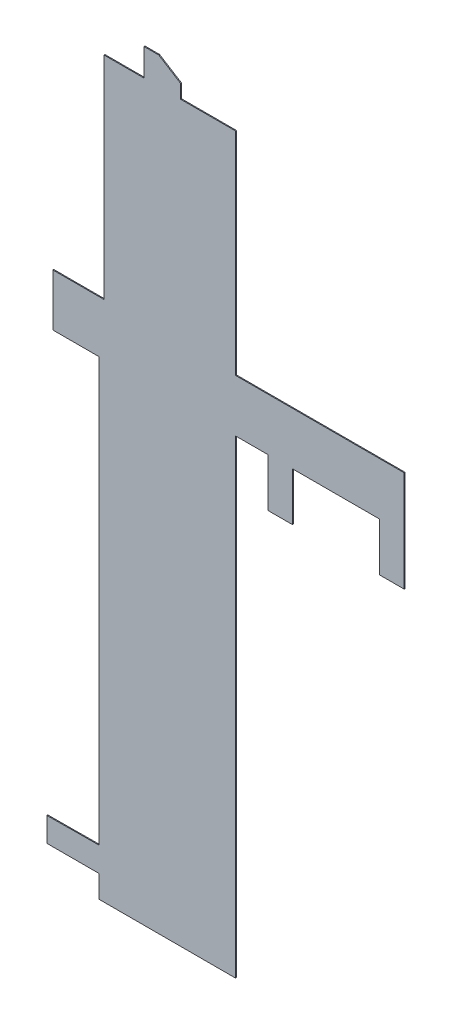
ISO-10303-21;
HEADER;
FILE_DESCRIPTION(('STEP AP214'),'2;1');
FILE_NAME('part.step','',(''),(''),'','','');
FILE_SCHEMA(('AUTOMOTIVE_DESIGN { 1 0 10303 214 1 1 1 1 }'));
ENDSEC;
DATA;
#1=APPLICATION_CONTEXT('core data for automotive mechanical design processes');
#2=APPLICATION_PROTOCOL_DEFINITION('international standard','automotive_design',2000,#1);
#3=PRODUCT_CONTEXT('',#1,'mechanical');
#4=PRODUCT('Part','Part','',(#3));
#5=PRODUCT_RELATED_PRODUCT_CATEGORY('part','',(#4));
#6=PRODUCT_DEFINITION_FORMATION('','',#4);
#7=PRODUCT_DEFINITION_CONTEXT('part definition',#1,'design');
#8=PRODUCT_DEFINITION('design','',#6,#7);
#9=PRODUCT_DEFINITION_SHAPE('','',#8);
#10=(LENGTH_UNIT() NAMED_UNIT(*) SI_UNIT(.MILLI.,.METRE.));
#11=(NAMED_UNIT(*) PLANE_ANGLE_UNIT() SI_UNIT($,.RADIAN.));
#12=(NAMED_UNIT(*) SI_UNIT($,.STERADIAN.) SOLID_ANGLE_UNIT());
#13=UNCERTAINTY_MEASURE_WITH_UNIT(LENGTH_MEASURE(1.E-05),#10,'distance_accuracy_value','');
#14=(GEOMETRIC_REPRESENTATION_CONTEXT(3) GLOBAL_UNCERTAINTY_ASSIGNED_CONTEXT((#13)) GLOBAL_UNIT_ASSIGNED_CONTEXT((#10,
#11,#12)) REPRESENTATION_CONTEXT('',''));
#15=CARTESIAN_POINT('',(0.,0.,0.));
#16=DIRECTION('',(0.,0.,1.));
#17=DIRECTION('',(1.,0.,0.));
#18=AXIS2_PLACEMENT_3D('',#15,#16,#17);
#19=CARTESIAN_POINT('',(0.,-1188.1,41.));
#20=DIRECTION('',(0.,-1.,0.));
#21=DIRECTION('',(0.,0.,-1.));
#22=AXIS2_PLACEMENT_3D('',#19,#20,#21);
#23=PLANE('',#22);
#24=DIRECTION('',(1.,0.,0.));
#25=VECTOR('',#24,1.);
#26=CARTESIAN_POINT('',(0.,-1188.1,42.));
#27=LINE('',#26,#25);
#28=CARTESIAN_POINT('',(393.000000000001,-1188.1,42.));
#29=VERTEX_POINT('',#28);
#30=CARTESIAN_POINT('',(542.500000000001,-1188.1,42.));
#31=VERTEX_POINT('',#30);
#32=EDGE_CURVE('E246',#29,#31,#27,.T.);
#33=ORIENTED_EDGE('',*,*,#32,.F.);
#34=DIRECTION('',(0.,0.,1.));
#35=VECTOR('',#34,1.);
#36=CARTESIAN_POINT('',(393.000000000001,-1188.1,41.));
#37=LINE('',#36,#35);
#38=CARTESIAN_POINT('',(393.000000000001,-1188.1,41.));
#39=VERTEX_POINT('',#38);
#40=EDGE_CURVE('E11',#39,#29,#37,.T.);
#41=ORIENTED_EDGE('',*,*,#40,.F.);
#42=DIRECTION('',(1.,0.,0.));
#43=VECTOR('',#42,1.);
#44=CARTESIAN_POINT('',(0.,-1188.1,41.));
#45=LINE('',#44,#43);
#46=CARTESIAN_POINT('',(542.500000000001,-1188.1,41.));
#47=VERTEX_POINT('',#46);
#48=EDGE_CURVE('E319',#39,#47,#45,.T.);
#49=ORIENTED_EDGE('',*,*,#48,.T.);
#50=DIRECTION('',(0.,0.,1.));
#51=VECTOR('',#50,1.);
#52=CARTESIAN_POINT('',(542.500000000001,-1188.1,41.));
#53=LINE('',#52,#51);
#54=EDGE_CURVE('E38',#47,#31,#53,.T.);
#55=ORIENTED_EDGE('',*,*,#54,.T.);
#56=EDGE_LOOP('',(#33,#41,#49,#55));
#57=FACE_BOUND('',#56,.T.);
#58=ADVANCED_FACE('F35',(#57),#23,.T.);
#59=CARTESIAN_POINT('',(393.000000000001,0.,41.));
#60=DIRECTION('',(-1.,0.,0.));
#61=DIRECTION('',(0.,0.,1.));
#62=AXIS2_PLACEMENT_3D('',#59,#60,#61);
#63=PLANE('',#62);
#64=DIRECTION('',(0.,-1.,0.));
#65=VECTOR('',#64,1.);
#66=CARTESIAN_POINT('',(393.000000000001,0.,42.));
#67=LINE('',#66,#65);
#68=CARTESIAN_POINT('',(393.000000000001,-1163.6,42.));
#69=VERTEX_POINT('',#68);
#70=EDGE_CURVE('E317',#69,#29,#67,.T.);
#71=ORIENTED_EDGE('',*,*,#70,.F.);
#72=DIRECTION('',(0.,0.,1.));
#73=VECTOR('',#72,1.);
#74=CARTESIAN_POINT('',(393.000000000001,-1163.6,41.));
#75=LINE('',#74,#73);
#76=CARTESIAN_POINT('',(393.000000000001,-1163.6,41.));
#77=VERTEX_POINT('',#76);
#78=EDGE_CURVE('E44',#77,#69,#75,.T.);
#79=ORIENTED_EDGE('',*,*,#78,.F.);
#80=DIRECTION('',(0.,-1.,0.));
#81=VECTOR('',#80,1.);
#82=CARTESIAN_POINT('',(393.000000000001,0.,41.));
#83=LINE('',#82,#81);
#84=EDGE_CURVE('E236',#77,#39,#83,.T.);
#85=ORIENTED_EDGE('',*,*,#84,.T.);
#86=ORIENTED_EDGE('',*,*,#40,.T.);
#87=EDGE_LOOP('',(#71,#79,#85,#86));
#88=FACE_BOUND('',#87,.T.);
#89=ADVANCED_FACE('F372',(#88),#63,.T.);
#90=CARTESIAN_POINT('',(0.,-1163.6,41.));
#91=DIRECTION('',(0.,-1.,0.));
#92=DIRECTION('',(0.,0.,-1.));
#93=AXIS2_PLACEMENT_3D('',#90,#91,#92);
#94=PLANE('',#93);
#95=DIRECTION('',(1.,0.,0.));
#96=VECTOR('',#95,1.);
#97=CARTESIAN_POINT('',(0.,-1163.6,42.));
#98=LINE('',#97,#96);
#99=CARTESIAN_POINT('',(336.,-1163.6,42.));
#100=VERTEX_POINT('',#99);
#101=EDGE_CURVE('E222',#100,#69,#98,.T.);
#102=ORIENTED_EDGE('',*,*,#101,.F.);
#103=DIRECTION('',(0.,0.,1.));
#104=VECTOR('',#103,1.);
#105=CARTESIAN_POINT('',(336.,-1163.6,41.));
#106=LINE('',#105,#104);
#107=CARTESIAN_POINT('',(336.,-1163.6,41.));
#108=VERTEX_POINT('',#107);
#109=EDGE_CURVE('E217',#108,#100,#106,.T.);
#110=ORIENTED_EDGE('',*,*,#109,.F.);
#111=DIRECTION('',(1.,0.,0.));
#112=VECTOR('',#111,1.);
#113=CARTESIAN_POINT('',(0.,-1163.6,41.));
#114=LINE('',#113,#112);
#115=EDGE_CURVE('E220',#108,#77,#114,.T.);
#116=ORIENTED_EDGE('',*,*,#115,.T.);
#117=ORIENTED_EDGE('',*,*,#78,.T.);
#118=EDGE_LOOP('',(#102,#110,#116,#117));
#119=FACE_BOUND('',#118,.T.);
#120=ADVANCED_FACE('F219',(#119),#94,.T.);
#121=CARTESIAN_POINT('',(336.,0.,41.));
#122=DIRECTION('',(-1.,0.,0.));
#123=DIRECTION('',(0.,0.,1.));
#124=AXIS2_PLACEMENT_3D('',#121,#122,#123);
#125=PLANE('',#124);
#126=DIRECTION('',(0.,-1.,0.));
#127=VECTOR('',#126,1.);
#128=CARTESIAN_POINT('',(336.,0.,42.));
#129=LINE('',#128,#127);
#130=CARTESIAN_POINT('',(336.,-1137.1,42.));
#131=VERTEX_POINT('',#130);
#132=EDGE_CURVE('E314',#131,#100,#129,.T.);
#133=ORIENTED_EDGE('',*,*,#132,.F.);
#134=DIRECTION('',(0.,0.,1.));
#135=VECTOR('',#134,1.);
#136=CARTESIAN_POINT('',(336.,-1137.1,41.));
#137=LINE('',#136,#135);
#138=CARTESIAN_POINT('',(336.,-1137.1,41.));
#139=VERTEX_POINT('',#138);
#140=EDGE_CURVE('E227',#139,#131,#137,.T.);
#141=ORIENTED_EDGE('',*,*,#140,.F.);
#142=DIRECTION('',(0.,-1.,0.));
#143=VECTOR('',#142,1.);
#144=CARTESIAN_POINT('',(336.,0.,41.));
#145=LINE('',#144,#143);
#146=EDGE_CURVE('E234',#139,#108,#145,.T.);
#147=ORIENTED_EDGE('',*,*,#146,.T.);
#148=ORIENTED_EDGE('',*,*,#109,.T.);
#149=EDGE_LOOP('',(#133,#141,#147,#148));
#150=FACE_BOUND('',#149,.T.);
#151=ADVANCED_FACE('F238',(#150),#125,.T.);
#152=CARTESIAN_POINT('',(7.99580199193842,-1139.40178384568,41.));
#153=DIRECTION('',(-0.00701737107335686,0.999975377948487,0.));
#154=DIRECTION('',(-0.999975377948487,-0.00701737107335686,0.));
#155=AXIS2_PLACEMENT_3D('',#152,#153,#154);
#156=PLANE('',#155);
#157=DIRECTION('',(-0.999975377948487,-0.00701737107335686,0.));
#158=VECTOR('',#157,1.);
#159=CARTESIAN_POINT('',(7.99580199193842,-1139.40178384568,42.));
#160=LINE('',#159,#158);
#161=CARTESIAN_POINT('',(393.000000000001,-1136.7,42.));
#162=VERTEX_POINT('',#161);
#163=EDGE_CURVE('E311',#162,#131,#160,.T.);
#164=ORIENTED_EDGE('',*,*,#163,.F.);
#165=DIRECTION('',(0.,0.,1.));
#166=VECTOR('',#165,1.);
#167=CARTESIAN_POINT('',(393.000000000001,-1136.7,41.));
#168=LINE('',#167,#166);
#169=CARTESIAN_POINT('',(393.000000000001,-1136.7,41.));
#170=VERTEX_POINT('',#169);
#171=EDGE_CURVE('E323',#170,#162,#168,.T.);
#172=ORIENTED_EDGE('',*,*,#171,.F.);
#173=DIRECTION('',(-0.999975377948487,-0.00701737107335686,0.));
#174=VECTOR('',#173,1.);
#175=CARTESIAN_POINT('',(7.99580199193842,-1139.40178384568,41.));
#176=LINE('',#175,#174);
#177=EDGE_CURVE('E239',#170,#139,#176,.T.);
#178=ORIENTED_EDGE('',*,*,#177,.T.);
#179=ORIENTED_EDGE('',*,*,#140,.T.);
#180=EDGE_LOOP('',(#164,#172,#178,#179));
#181=FACE_BOUND('',#180,.T.);
#182=ADVANCED_FACE('F385',(#181),#156,.T.);
#183=CARTESIAN_POINT('',(393.000000000001,0.,41.));
#184=DIRECTION('',(-1.,0.,0.));
#185=DIRECTION('',(0.,0.,1.));
#186=AXIS2_PLACEMENT_3D('',#183,#184,#185);
#187=PLANE('',#186);
#188=DIRECTION('',(0.,-1.,0.));
#189=VECTOR('',#188,1.);
#190=CARTESIAN_POINT('',(393.000000000001,0.,42.));
#191=LINE('',#190,#189);
#192=CARTESIAN_POINT('',(393.000000000001,-673.199999999998,42.));
#193=VERTEX_POINT('',#192);
#194=EDGE_CURVE('E308',#193,#162,#191,.T.);
#195=ORIENTED_EDGE('',*,*,#194,.F.);
#196=DIRECTION('',(0.,0.,1.));
#197=VECTOR('',#196,1.);
#198=CARTESIAN_POINT('',(393.000000000001,-673.199999999998,41.));
#199=LINE('',#198,#197);
#200=CARTESIAN_POINT('',(393.000000000001,-673.199999999998,41.));
#201=VERTEX_POINT('',#200);
#202=EDGE_CURVE('E325',#201,#193,#199,.T.);
#203=ORIENTED_EDGE('',*,*,#202,.F.);
#204=DIRECTION('',(0.,-1.,0.));
#205=VECTOR('',#204,1.);
#206=CARTESIAN_POINT('',(393.000000000001,0.,41.));
#207=LINE('',#206,#205);
#208=EDGE_CURVE('E241',#201,#170,#207,.T.);
#209=ORIENTED_EDGE('',*,*,#208,.T.);
#210=ORIENTED_EDGE('',*,*,#171,.T.);
#211=EDGE_LOOP('',(#195,#203,#209,#210));
#212=FACE_BOUND('',#211,.T.);
#213=ADVANCED_FACE('F388',(#212),#187,.T.);
#214=CARTESIAN_POINT('',(0.,-673.199999999998,41.));
#215=DIRECTION('',(0.,1.,0.));
#216=DIRECTION('',(0.,0.,1.));
#217=AXIS2_PLACEMENT_3D('',#214,#215,#216);
#218=PLANE('',#217);
#219=DIRECTION('',(-1.,0.,0.));
#220=VECTOR('',#219,1.);
#221=CARTESIAN_POINT('',(0.,-673.199999999998,42.));
#222=LINE('',#221,#220);
#223=CARTESIAN_POINT('',(342.500000000001,-673.199999999998,42.));
#224=VERTEX_POINT('',#223);
#225=EDGE_CURVE('E306',#193,#224,#222,.T.);
#226=ORIENTED_EDGE('',*,*,#225,.T.);
#227=DIRECTION('',(0.,0.,1.));
#228=VECTOR('',#227,1.);
#229=CARTESIAN_POINT('',(342.500000000001,-673.199999999998,41.));
#230=LINE('',#229,#228);
#231=CARTESIAN_POINT('',(342.500000000001,-673.199999999998,41.));
#232=VERTEX_POINT('',#231);
#233=EDGE_CURVE('E327',#232,#224,#230,.T.);
#234=ORIENTED_EDGE('',*,*,#233,.F.);
#235=DIRECTION('',(-1.,0.,0.));
#236=VECTOR('',#235,1.);
#237=CARTESIAN_POINT('',(0.,-673.199999999998,41.));
#238=LINE('',#237,#236);
#239=EDGE_CURVE('E554',#201,#232,#238,.T.);
#240=ORIENTED_EDGE('',*,*,#239,.F.);
#241=ORIENTED_EDGE('',*,*,#202,.T.);
#242=EDGE_LOOP('',(#226,#234,#240,#241));
#243=FACE_BOUND('',#242,.T.);
#244=ADVANCED_FACE('F392',(#243),#218,.F.);
#245=CARTESIAN_POINT('',(342.499999999994,3.66909232041685E-12,41.));
#246=DIRECTION('',(1.,0.,0.));
#247=DIRECTION('',(0.,1.,0.));
#248=AXIS2_PLACEMENT_3D('',#245,#246,#247);
#249=PLANE('',#248);
#250=DIRECTION('',(0.,1.,0.));
#251=VECTOR('',#250,1.);
#252=CARTESIAN_POINT('',(342.499999999994,3.66909232041685E-12,42.));
#253=LINE('',#252,#251);
#254=CARTESIAN_POINT('',(342.500000000001,-616.199999999998,42.));
#255=VERTEX_POINT('',#254);
#256=EDGE_CURVE('E304',#224,#255,#253,.T.);
#257=ORIENTED_EDGE('',*,*,#256,.T.);
#258=DIRECTION('',(0.,0.,1.));
#259=VECTOR('',#258,1.);
#260=CARTESIAN_POINT('',(342.500000000001,-616.199999999998,41.));
#261=LINE('',#260,#259);
#262=CARTESIAN_POINT('',(342.500000000001,-616.199999999998,41.));
#263=VERTEX_POINT('',#262);
#264=EDGE_CURVE('E330',#263,#255,#261,.T.);
#265=ORIENTED_EDGE('',*,*,#264,.F.);
#266=DIRECTION('',(0.,1.,0.));
#267=VECTOR('',#266,1.);
#268=CARTESIAN_POINT('',(342.499999999994,3.66909232041685E-12,41.));
#269=LINE('',#268,#267);
#270=EDGE_CURVE('E546',#232,#263,#269,.T.);
#271=ORIENTED_EDGE('',*,*,#270,.F.);
#272=ORIENTED_EDGE('',*,*,#233,.T.);
#273=EDGE_LOOP('',(#257,#265,#271,#272));
#274=FACE_BOUND('',#273,.T.);
#275=ADVANCED_FACE('F396',(#274),#249,.F.);
#276=CARTESIAN_POINT('',(-1.36823885554802E-11,-616.199999999989,41.));
#277=DIRECTION('',(0.,-1.,0.));
#278=DIRECTION('',(1.,0.,0.));
#279=AXIS2_PLACEMENT_3D('',#276,#277,#278);
#280=PLANE('',#279);
#281=DIRECTION('',(1.,0.,0.));
#282=VECTOR('',#281,1.);
#283=CARTESIAN_POINT('',(-1.36823885554802E-11,-616.199999999989,42.));
#284=LINE('',#283,#282);
#285=CARTESIAN_POINT('',(398.500000000001,-616.199999999998,42.));
#286=VERTEX_POINT('',#285);
#287=EDGE_CURVE('E301',#255,#286,#284,.T.);
#288=ORIENTED_EDGE('',*,*,#287,.T.);
#289=DIRECTION('',(0.,0.,1.));
#290=VECTOR('',#289,1.);
#291=CARTESIAN_POINT('',(398.500000000001,-616.199999999998,41.));
#292=LINE('',#291,#290);
#293=CARTESIAN_POINT('',(398.500000000001,-616.199999999998,41.));
#294=VERTEX_POINT('',#293);
#295=EDGE_CURVE('E333',#294,#286,#292,.T.);
#296=ORIENTED_EDGE('',*,*,#295,.F.);
#297=DIRECTION('',(1.,0.,0.));
#298=VECTOR('',#297,1.);
#299=CARTESIAN_POINT('',(-1.36823885554802E-11,-616.199999999989,41.));
#300=LINE('',#299,#298);
#301=EDGE_CURVE('E544',#263,#294,#300,.T.);
#302=ORIENTED_EDGE('',*,*,#301,.F.);
#303=ORIENTED_EDGE('',*,*,#264,.T.);
#304=EDGE_LOOP('',(#288,#296,#302,#303));
#305=FACE_BOUND('',#304,.T.);
#306=ADVANCED_FACE('F400',(#305),#280,.F.);
#307=CARTESIAN_POINT('',(398.500000000001,0.,41.));
#308=DIRECTION('',(-1.,0.,0.));
#309=DIRECTION('',(0.,0.,1.));
#310=AXIS2_PLACEMENT_3D('',#307,#308,#309);
#311=PLANE('',#310);
#312=DIRECTION('',(0.,-1.,0.));
#313=VECTOR('',#312,1.);
#314=CARTESIAN_POINT('',(398.500000000001,0.,42.));
#315=LINE('',#314,#313);
#316=CARTESIAN_POINT('',(398.500000000001,-384.199999999999,42.));
#317=VERTEX_POINT('',#316);
#318=EDGE_CURVE('E298',#317,#286,#315,.T.);
#319=ORIENTED_EDGE('',*,*,#318,.F.);
#320=DIRECTION('',(0.,0.,1.));
#321=VECTOR('',#320,1.);
#322=CARTESIAN_POINT('',(398.500000000001,-384.199999999999,41.));
#323=LINE('',#322,#321);
#324=CARTESIAN_POINT('',(398.500000000001,-384.199999999999,41.));
#325=VERTEX_POINT('',#324);
#326=EDGE_CURVE('E335',#325,#317,#323,.T.);
#327=ORIENTED_EDGE('',*,*,#326,.F.);
#328=DIRECTION('',(0.,-1.,0.));
#329=VECTOR('',#328,1.);
#330=CARTESIAN_POINT('',(398.500000000001,0.,41.));
#331=LINE('',#330,#329);
#332=EDGE_CURVE('E541',#325,#294,#331,.T.);
#333=ORIENTED_EDGE('',*,*,#332,.T.);
#334=ORIENTED_EDGE('',*,*,#295,.T.);
#335=EDGE_LOOP('',(#319,#327,#333,#334));
#336=FACE_BOUND('',#335,.T.);
#337=ADVANCED_FACE('F404',(#336),#311,.T.);
#338=CARTESIAN_POINT('',(0.,-384.199999999999,41.));
#339=DIRECTION('',(0.,-1.,0.));
#340=DIRECTION('',(0.,0.,-1.));
#341=AXIS2_PLACEMENT_3D('',#338,#339,#340);
#342=PLANE('',#341);
#343=DIRECTION('',(1.,0.,0.));
#344=VECTOR('',#343,1.);
#345=CARTESIAN_POINT('',(0.,-384.199999999999,42.));
#346=LINE('',#345,#344);
#347=CARTESIAN_POINT('',(442.5,-384.2,42.));
#348=VERTEX_POINT('',#347);
#349=EDGE_CURVE('E295',#317,#348,#346,.T.);
#350=ORIENTED_EDGE('',*,*,#349,.T.);
#351=DIRECTION('',(0.,0.,1.));
#352=VECTOR('',#351,1.);
#353=CARTESIAN_POINT('',(442.5,-384.2,41.));
#354=LINE('',#353,#352);
#355=CARTESIAN_POINT('',(442.5,-384.2,41.));
#356=VERTEX_POINT('',#355);
#357=EDGE_CURVE('E338',#356,#348,#354,.T.);
#358=ORIENTED_EDGE('',*,*,#357,.F.);
#359=DIRECTION('',(1.,0.,0.));
#360=VECTOR('',#359,1.);
#361=CARTESIAN_POINT('',(0.,-384.199999999999,41.));
#362=LINE('',#361,#360);
#363=EDGE_CURVE('E560',#325,#356,#362,.T.);
#364=ORIENTED_EDGE('',*,*,#363,.F.);
#365=ORIENTED_EDGE('',*,*,#326,.T.);
#366=EDGE_LOOP('',(#350,#358,#364,#365));
#367=FACE_BOUND('',#366,.T.);
#368=ADVANCED_FACE('F408',(#367),#342,.F.);
#369=CARTESIAN_POINT('',(442.500000000001,-8.1878948066106E-13,41.));
#370=DIRECTION('',(-1.,0.,0.));
#371=DIRECTION('',(0.,-1.,0.));
#372=AXIS2_PLACEMENT_3D('',#369,#370,#371);
#373=PLANE('',#372);
#374=DIRECTION('',(0.,-1.,0.));
#375=VECTOR('',#374,1.);
#376=CARTESIAN_POINT('',(442.500000000001,-8.1878948066106E-13,42.));
#377=LINE('',#376,#375);
#378=CARTESIAN_POINT('',(442.5,-354.2,42.));
#379=VERTEX_POINT('',#378);
#380=EDGE_CURVE('E292',#379,#348,#377,.T.);
#381=ORIENTED_EDGE('',*,*,#380,.F.);
#382=DIRECTION('',(0.,0.,1.));
#383=VECTOR('',#382,1.);
#384=CARTESIAN_POINT('',(442.5,-354.2,41.));
#385=LINE('',#384,#383);
#386=CARTESIAN_POINT('',(442.5,-354.2,41.));
#387=VERTEX_POINT('',#386);
#388=EDGE_CURVE('E340',#387,#379,#385,.T.);
#389=ORIENTED_EDGE('',*,*,#388,.F.);
#390=DIRECTION('',(0.,-1.,0.));
#391=VECTOR('',#390,1.);
#392=CARTESIAN_POINT('',(442.500000000001,-8.1878948066106E-13,41.));
#393=LINE('',#392,#391);
#394=EDGE_CURVE('E533',#387,#356,#393,.T.);
#395=ORIENTED_EDGE('',*,*,#394,.T.);
#396=ORIENTED_EDGE('',*,*,#357,.T.);
#397=EDGE_LOOP('',(#381,#389,#395,#396));
#398=FACE_BOUND('',#397,.T.);
#399=ADVANCED_FACE('F412',(#398),#373,.T.);
#400=CARTESIAN_POINT('',(1.22887811038196E-12,-354.200000000002,41.));
#401=DIRECTION('',(0.,1.,0.));
#402=DIRECTION('',(-1.,0.,0.));
#403=AXIS2_PLACEMENT_3D('',#400,#401,#402);
#404=PLANE('',#403);
#405=DIRECTION('',(-1.,0.,0.));
#406=VECTOR('',#405,1.);
#407=CARTESIAN_POINT('',(1.22887811038196E-12,-354.200000000002,42.));
#408=LINE('',#407,#406);
#409=CARTESIAN_POINT('',(458.5,-354.2,42.));
#410=VERTEX_POINT('',#409);
#411=EDGE_CURVE('E289',#410,#379,#408,.T.);
#412=ORIENTED_EDGE('',*,*,#411,.F.);
#413=DIRECTION('',(0.,0.,1.));
#414=VECTOR('',#413,1.);
#415=CARTESIAN_POINT('',(458.5,-354.2,41.));
#416=LINE('',#415,#414);
#417=CARTESIAN_POINT('',(458.5,-354.2,41.));
#418=VERTEX_POINT('',#417);
#419=EDGE_CURVE('E342',#418,#410,#416,.T.);
#420=ORIENTED_EDGE('',*,*,#419,.F.);
#421=DIRECTION('',(-1.,0.,0.));
#422=VECTOR('',#421,1.);
#423=CARTESIAN_POINT('',(1.22887811038196E-12,-354.200000000002,41.));
#424=LINE('',#423,#422);
#425=EDGE_CURVE('E529',#418,#387,#424,.T.);
#426=ORIENTED_EDGE('',*,*,#425,.T.);
#427=ORIENTED_EDGE('',*,*,#388,.T.);
#428=EDGE_LOOP('',(#412,#420,#426,#427));
#429=FACE_BOUND('',#428,.T.);
#430=ADVANCED_FACE('F416',(#429),#404,.T.);
#431=CARTESIAN_POINT('',(-30.3988764044927,-48.6382022471876,41.));
#432=DIRECTION('',(0.529998940003185,0.847998304005085,0.));
#433=DIRECTION('',(-0.847998304005085,0.529998940003185,0.));
#434=AXIS2_PLACEMENT_3D('',#431,#432,#433);
#435=PLANE('',#434);
#436=DIRECTION('',(-0.847998304005085,0.529998940003185,0.));
#437=VECTOR('',#436,1.);
#438=CARTESIAN_POINT('',(-30.3988764044927,-48.6382022471876,42.));
#439=LINE('',#438,#437);
#440=CARTESIAN_POINT('',(482.5,-369.2,42.));
#441=VERTEX_POINT('',#440);
#442=EDGE_CURVE('E286',#441,#410,#439,.T.);
#443=ORIENTED_EDGE('',*,*,#442,.F.);
#444=DIRECTION('',(0.,0.,1.));
#445=VECTOR('',#444,1.);
#446=CARTESIAN_POINT('',(482.5,-369.2,41.));
#447=LINE('',#446,#445);
#448=CARTESIAN_POINT('',(482.5,-369.2,41.));
#449=VERTEX_POINT('',#448);
#450=EDGE_CURVE('E344',#449,#441,#447,.T.);
#451=ORIENTED_EDGE('',*,*,#450,.F.);
#452=DIRECTION('',(-0.847998304005085,0.529998940003185,0.));
#453=VECTOR('',#452,1.);
#454=CARTESIAN_POINT('',(-30.3988764044927,-48.6382022471876,41.));
#455=LINE('',#454,#453);
#456=EDGE_CURVE('E524',#449,#418,#455,.T.);
#457=ORIENTED_EDGE('',*,*,#456,.T.);
#458=ORIENTED_EDGE('',*,*,#419,.T.);
#459=EDGE_LOOP('',(#443,#451,#457,#458));
#460=FACE_BOUND('',#459,.T.);
#461=ADVANCED_FACE('F420',(#460),#435,.T.);
#462=CARTESIAN_POINT('',(482.499999999998,2.06827262309514E-12,41.));
#463=DIRECTION('',(-1.,0.,0.));
#464=DIRECTION('',(0.,-1.,0.));
#465=AXIS2_PLACEMENT_3D('',#462,#463,#464);
#466=PLANE('',#465);
#467=DIRECTION('',(0.,-1.,0.));
#468=VECTOR('',#467,1.);
#469=CARTESIAN_POINT('',(482.499999999998,2.06827262309514E-12,42.));
#470=LINE('',#469,#468);
#471=CARTESIAN_POINT('',(482.5,-384.2,42.));
#472=VERTEX_POINT('',#471);
#473=EDGE_CURVE('E283',#441,#472,#470,.T.);
#474=ORIENTED_EDGE('',*,*,#473,.T.);
#475=DIRECTION('',(0.,0.,1.));
#476=VECTOR('',#475,1.);
#477=CARTESIAN_POINT('',(482.5,-384.2,41.));
#478=LINE('',#477,#476);
#479=CARTESIAN_POINT('',(482.5,-384.2,41.));
#480=VERTEX_POINT('',#479);
#481=EDGE_CURVE('E346',#480,#472,#478,.T.);
#482=ORIENTED_EDGE('',*,*,#481,.F.);
#483=DIRECTION('',(0.,-1.,0.));
#484=VECTOR('',#483,1.);
#485=CARTESIAN_POINT('',(482.499999999998,2.06827262309514E-12,41.));
#486=LINE('',#485,#484);
#487=EDGE_CURVE('E521',#449,#480,#486,.T.);
#488=ORIENTED_EDGE('',*,*,#487,.F.);
#489=ORIENTED_EDGE('',*,*,#450,.T.);
#490=EDGE_LOOP('',(#474,#482,#488,#489));
#491=FACE_BOUND('',#490,.T.);
#492=ADVANCED_FACE('F424',(#491),#466,.F.);
#493=CARTESIAN_POINT('',(-3.55456405050817E-12,-384.199999999996,41.));
#494=DIRECTION('',(0.,1.,0.));
#495=DIRECTION('',(-1.,0.,0.));
#496=AXIS2_PLACEMENT_3D('',#493,#494,#495);
#497=PLANE('',#496);
#498=DIRECTION('',(-1.,0.,0.));
#499=VECTOR('',#498,1.);
#500=CARTESIAN_POINT('',(-3.55456405050817E-12,-384.199999999996,42.));
#501=LINE('',#500,#499);
#502=CARTESIAN_POINT('',(542.5,-384.200000000001,42.));
#503=VERTEX_POINT('',#502);
#504=EDGE_CURVE('E280',#503,#472,#501,.T.);
#505=ORIENTED_EDGE('',*,*,#504,.F.);
#506=DIRECTION('',(0.,0.,1.));
#507=VECTOR('',#506,1.);
#508=CARTESIAN_POINT('',(542.5,-384.200000000001,41.));
#509=LINE('',#508,#507);
#510=CARTESIAN_POINT('',(542.5,-384.200000000001,41.));
#511=VERTEX_POINT('',#510);
#512=EDGE_CURVE('E348',#511,#503,#509,.T.);
#513=ORIENTED_EDGE('',*,*,#512,.F.);
#514=DIRECTION('',(-1.,0.,0.));
#515=VECTOR('',#514,1.);
#516=CARTESIAN_POINT('',(-3.55456405050817E-12,-384.199999999996,41.));
#517=LINE('',#516,#515);
#518=EDGE_CURVE('E519',#511,#480,#517,.T.);
#519=ORIENTED_EDGE('',*,*,#518,.T.);
#520=ORIENTED_EDGE('',*,*,#481,.T.);
#521=EDGE_LOOP('',(#505,#513,#519,#520));
#522=FACE_BOUND('',#521,.T.);
#523=ADVANCED_FACE('F428',(#522),#497,.T.);
#524=CARTESIAN_POINT('',(542.500000000004,-6.14587745774645E-12,41.));
#525=DIRECTION('',(1.,0.,0.));
#526=DIRECTION('',(0.,1.,0.));
#527=AXIS2_PLACEMENT_3D('',#524,#525,#526);
#528=PLANE('',#527);
#529=DIRECTION('',(0.,1.,0.));
#530=VECTOR('',#529,1.);
#531=CARTESIAN_POINT('',(542.500000000004,-6.14587745774645E-12,42.));
#532=LINE('',#531,#530);
#533=CARTESIAN_POINT('',(542.5,-616.2,42.));
#534=VERTEX_POINT('',#533);
#535=EDGE_CURVE('E277',#534,#503,#532,.T.);
#536=ORIENTED_EDGE('',*,*,#535,.F.);
#537=DIRECTION('',(0.,0.,1.));
#538=VECTOR('',#537,1.);
#539=CARTESIAN_POINT('',(542.5,-616.2,41.));
#540=LINE('',#539,#538);
#541=CARTESIAN_POINT('',(542.5,-616.2,41.));
#542=VERTEX_POINT('',#541);
#543=EDGE_CURVE('E350',#542,#534,#540,.T.);
#544=ORIENTED_EDGE('',*,*,#543,.F.);
#545=DIRECTION('',(0.,1.,0.));
#546=VECTOR('',#545,1.);
#547=CARTESIAN_POINT('',(542.500000000004,-6.14587745774645E-12,41.));
#548=LINE('',#547,#546);
#549=EDGE_CURVE('E567',#542,#511,#548,.T.);
#550=ORIENTED_EDGE('',*,*,#549,.T.);
#551=ORIENTED_EDGE('',*,*,#512,.T.);
#552=EDGE_LOOP('',(#536,#544,#550,#551));
#553=FACE_BOUND('',#552,.T.);
#554=ADVANCED_FACE('F432',(#553),#528,.T.);
#555=CARTESIAN_POINT('',(0.,-616.2,41.));
#556=DIRECTION('',(0.,1.,0.));
#557=DIRECTION('',(0.,0.,1.));
#558=AXIS2_PLACEMENT_3D('',#555,#556,#557);
#559=PLANE('',#558);
#560=DIRECTION('',(-1.,0.,0.));
#561=VECTOR('',#560,1.);
#562=CARTESIAN_POINT('',(0.,-616.2,42.));
#563=LINE('',#562,#561);
#564=CARTESIAN_POINT('',(727.5,-616.2,42.));
#565=VERTEX_POINT('',#564);
#566=EDGE_CURVE('E274',#565,#534,#563,.T.);
#567=ORIENTED_EDGE('',*,*,#566,.F.);
#568=DIRECTION('',(0.,0.,1.));
#569=VECTOR('',#568,1.);
#570=CARTESIAN_POINT('',(727.5,-616.2,41.));
#571=LINE('',#570,#569);
#572=CARTESIAN_POINT('',(727.5,-616.2,41.));
#573=VERTEX_POINT('',#572);
#574=EDGE_CURVE('E352',#573,#565,#571,.T.);
#575=ORIENTED_EDGE('',*,*,#574,.F.);
#576=DIRECTION('',(-1.,0.,0.));
#577=VECTOR('',#576,1.);
#578=CARTESIAN_POINT('',(0.,-616.2,41.));
#579=LINE('',#578,#577);
#580=EDGE_CURVE('E510',#573,#542,#579,.T.);
#581=ORIENTED_EDGE('',*,*,#580,.T.);
#582=ORIENTED_EDGE('',*,*,#543,.T.);
#583=EDGE_LOOP('',(#567,#575,#581,#582));
#584=FACE_BOUND('',#583,.T.);
#585=ADVANCED_FACE('F436',(#584),#559,.T.);
#586=CARTESIAN_POINT('',(727.5,0.,41.));
#587=DIRECTION('',(1.,0.,0.));
#588=DIRECTION('',(0.,0.,-1.));
#589=AXIS2_PLACEMENT_3D('',#586,#587,#588);
#590=PLANE('',#589);
#591=DIRECTION('',(0.,1.,0.));
#592=VECTOR('',#591,1.);
#593=CARTESIAN_POINT('',(727.5,0.,42.));
#594=LINE('',#593,#592);
#595=CARTESIAN_POINT('',(727.5,-726.599999999999,42.));
#596=VERTEX_POINT('',#595);
#597=EDGE_CURVE('E271',#596,#565,#594,.T.);
#598=ORIENTED_EDGE('',*,*,#597,.F.);
#599=DIRECTION('',(0.,0.,1.));
#600=VECTOR('',#599,1.);
#601=CARTESIAN_POINT('',(727.5,-726.599999999999,41.));
#602=LINE('',#601,#600);
#603=CARTESIAN_POINT('',(727.5,-726.599999999999,41.));
#604=VERTEX_POINT('',#603);
#605=EDGE_CURVE('E354',#604,#596,#602,.T.);
#606=ORIENTED_EDGE('',*,*,#605,.F.);
#607=DIRECTION('',(0.,1.,0.));
#608=VECTOR('',#607,1.);
#609=CARTESIAN_POINT('',(727.5,0.,41.));
#610=LINE('',#609,#608);
#611=EDGE_CURVE('E506',#604,#573,#610,.T.);
#612=ORIENTED_EDGE('',*,*,#611,.T.);
#613=ORIENTED_EDGE('',*,*,#574,.T.);
#614=EDGE_LOOP('',(#598,#606,#612,#613));
#615=FACE_BOUND('',#614,.T.);
#616=ADVANCED_FACE('F440',(#615),#590,.T.);
#617=CARTESIAN_POINT('',(0.,-726.599999999999,41.));
#618=DIRECTION('',(0.,-1.,0.));
#619=DIRECTION('',(0.,0.,-1.));
#620=AXIS2_PLACEMENT_3D('',#617,#618,#619);
#621=PLANE('',#620);
#622=DIRECTION('',(1.,0.,0.));
#623=VECTOR('',#622,1.);
#624=CARTESIAN_POINT('',(0.,-726.599999999999,42.));
#625=LINE('',#624,#623);
#626=CARTESIAN_POINT('',(700.5,-726.599999999999,42.));
#627=VERTEX_POINT('',#626);
#628=EDGE_CURVE('E268',#627,#596,#625,.T.);
#629=ORIENTED_EDGE('',*,*,#628,.F.);
#630=DIRECTION('',(0.,0.,1.));
#631=VECTOR('',#630,1.);
#632=CARTESIAN_POINT('',(700.5,-726.599999999999,41.));
#633=LINE('',#632,#631);
#634=CARTESIAN_POINT('',(700.5,-726.599999999999,41.));
#635=VERTEX_POINT('',#634);
#636=EDGE_CURVE('E356',#635,#627,#633,.T.);
#637=ORIENTED_EDGE('',*,*,#636,.F.);
#638=DIRECTION('',(1.,0.,0.));
#639=VECTOR('',#638,1.);
#640=CARTESIAN_POINT('',(0.,-726.599999999999,41.));
#641=LINE('',#640,#639);
#642=EDGE_CURVE('E571',#635,#604,#641,.T.);
#643=ORIENTED_EDGE('',*,*,#642,.T.);
#644=ORIENTED_EDGE('',*,*,#605,.T.);
#645=EDGE_LOOP('',(#629,#637,#643,#644));
#646=FACE_BOUND('',#645,.T.);
#647=ADVANCED_FACE('F444',(#646),#621,.T.);
#648=CARTESIAN_POINT('',(700.499999999998,1.46737967688664E-12,41.));
#649=DIRECTION('',(-1.,0.,0.));
#650=DIRECTION('',(0.,-1.,0.));
#651=AXIS2_PLACEMENT_3D('',#648,#649,#650);
#652=PLANE('',#651);
#653=DIRECTION('',(0.,-1.,0.));
#654=VECTOR('',#653,1.);
#655=CARTESIAN_POINT('',(700.499999999998,1.46737967688664E-12,42.));
#656=LINE('',#655,#654);
#657=CARTESIAN_POINT('',(700.5,-673.599999999999,42.));
#658=VERTEX_POINT('',#657);
#659=EDGE_CURVE('E265',#658,#627,#656,.T.);
#660=ORIENTED_EDGE('',*,*,#659,.F.);
#661=DIRECTION('',(0.,0.,1.));
#662=VECTOR('',#661,1.);
#663=CARTESIAN_POINT('',(700.5,-673.599999999999,41.));
#664=LINE('',#663,#662);
#665=CARTESIAN_POINT('',(700.5,-673.599999999999,41.));
#666=VERTEX_POINT('',#665);
#667=EDGE_CURVE('E358',#666,#658,#664,.T.);
#668=ORIENTED_EDGE('',*,*,#667,.F.);
#669=DIRECTION('',(0.,-1.,0.));
#670=VECTOR('',#669,1.);
#671=CARTESIAN_POINT('',(700.499999999998,1.46737967688664E-12,41.));
#672=LINE('',#671,#670);
#673=EDGE_CURVE('E499',#666,#635,#672,.T.);
#674=ORIENTED_EDGE('',*,*,#673,.T.);
#675=ORIENTED_EDGE('',*,*,#636,.T.);
#676=EDGE_LOOP('',(#660,#668,#674,#675));
#677=FACE_BOUND('',#676,.T.);
#678=ADVANCED_FACE('F448',(#677),#652,.T.);
#679=CARTESIAN_POINT('',(2.10660909686632E-12,-673.600000000001,41.));
#680=DIRECTION('',(0.,-1.,0.));
#681=DIRECTION('',(1.,0.,0.));
#682=AXIS2_PLACEMENT_3D('',#679,#680,#681);
#683=PLANE('',#682);
#684=DIRECTION('',(1.,0.,0.));
#685=VECTOR('',#684,1.);
#686=CARTESIAN_POINT('',(2.10660909686632E-12,-673.600000000001,42.));
#687=LINE('',#686,#685);
#688=CARTESIAN_POINT('',(604.999999999999,-673.599999999999,42.));
#689=VERTEX_POINT('',#688);
#690=EDGE_CURVE('E256',#689,#658,#687,.T.);
#691=ORIENTED_EDGE('',*,*,#690,.F.);
#692=DIRECTION('',(0.,0.,1.));
#693=VECTOR('',#692,1.);
#694=CARTESIAN_POINT('',(604.999999999999,-673.599999999999,41.));
#695=LINE('',#694,#693);
#696=CARTESIAN_POINT('',(604.999999999999,-673.599999999999,41.));
#697=VERTEX_POINT('',#696);
#698=EDGE_CURVE('E360',#697,#689,#695,.T.);
#699=ORIENTED_EDGE('',*,*,#698,.F.);
#700=DIRECTION('',(1.,0.,0.));
#701=VECTOR('',#700,1.);
#702=CARTESIAN_POINT('',(2.10660909686632E-12,-673.600000000001,41.));
#703=LINE('',#702,#701);
#704=EDGE_CURVE('E495',#697,#666,#703,.T.);
#705=ORIENTED_EDGE('',*,*,#704,.T.);
#706=ORIENTED_EDGE('',*,*,#667,.T.);
#707=EDGE_LOOP('',(#691,#699,#705,#706));
#708=FACE_BOUND('',#707,.T.);
#709=ADVANCED_FACE('F452',(#708),#683,.T.);
#710=CARTESIAN_POINT('',(604.999999999998,1.26733005641173E-12,41.));
#711=DIRECTION('',(1.,0.,0.));
#712=DIRECTION('',(0.,1.,0.));
#713=AXIS2_PLACEMENT_3D('',#710,#711,#712);
#714=PLANE('',#713);
#715=DIRECTION('',(0.,1.,0.));
#716=VECTOR('',#715,1.);
#717=CARTESIAN_POINT('',(604.999999999998,1.26733005641173E-12,42.));
#718=LINE('',#717,#716);
#719=CARTESIAN_POINT('',(605.,-726.599999999999,42.));
#720=VERTEX_POINT('',#719);
#721=EDGE_CURVE('E262',#720,#689,#718,.T.);
#722=ORIENTED_EDGE('',*,*,#721,.F.);
#723=DIRECTION('',(0.,0.,1.));
#724=VECTOR('',#723,1.);
#725=CARTESIAN_POINT('',(605.,-726.599999999999,41.));
#726=LINE('',#725,#724);
#727=CARTESIAN_POINT('',(605.,-726.599999999999,41.));
#728=VERTEX_POINT('',#727);
#729=EDGE_CURVE('E362',#728,#720,#726,.T.);
#730=ORIENTED_EDGE('',*,*,#729,.F.);
#731=DIRECTION('',(0.,1.,0.));
#732=VECTOR('',#731,1.);
#733=CARTESIAN_POINT('',(604.999999999998,1.26733005641173E-12,41.));
#734=LINE('',#733,#732);
#735=EDGE_CURVE('E574',#728,#697,#734,.T.);
#736=ORIENTED_EDGE('',*,*,#735,.T.);
#737=ORIENTED_EDGE('',*,*,#698,.T.);
#738=EDGE_LOOP('',(#722,#730,#736,#737));
#739=FACE_BOUND('',#738,.T.);
#740=ADVANCED_FACE('F456',(#739),#714,.T.);
#741=CARTESIAN_POINT('',(0.,-726.599999999999,41.));
#742=DIRECTION('',(0.,-1.,0.));
#743=DIRECTION('',(0.,0.,-1.));
#744=AXIS2_PLACEMENT_3D('',#741,#742,#743);
#745=PLANE('',#744);
#746=DIRECTION('',(1.,0.,0.));
#747=VECTOR('',#746,1.);
#748=CARTESIAN_POINT('',(0.,-726.599999999999,42.));
#749=LINE('',#748,#747);
#750=CARTESIAN_POINT('',(578.,-726.599999999999,42.));
#751=VERTEX_POINT('',#750);
#752=EDGE_CURVE('E259',#751,#720,#749,.T.);
#753=ORIENTED_EDGE('',*,*,#752,.F.);
#754=DIRECTION('',(0.,0.,1.));
#755=VECTOR('',#754,1.);
#756=CARTESIAN_POINT('',(578.,-726.599999999999,41.));
#757=LINE('',#756,#755);
#758=CARTESIAN_POINT('',(578.,-726.599999999999,41.));
#759=VERTEX_POINT('',#758);
#760=EDGE_CURVE('E364',#759,#751,#757,.T.);
#761=ORIENTED_EDGE('',*,*,#760,.F.);
#762=DIRECTION('',(1.,0.,0.));
#763=VECTOR('',#762,1.);
#764=CARTESIAN_POINT('',(0.,-726.599999999999,41.));
#765=LINE('',#764,#763);
#766=EDGE_CURVE('E487',#759,#728,#765,.T.);
#767=ORIENTED_EDGE('',*,*,#766,.T.);
#768=ORIENTED_EDGE('',*,*,#729,.T.);
#769=EDGE_LOOP('',(#753,#761,#767,#768));
#770=FACE_BOUND('',#769,.T.);
#771=ADVANCED_FACE('F461',(#770),#745,.T.);
#772=CARTESIAN_POINT('',(577.999999999998,1.21077152496856E-12,41.));
#773=DIRECTION('',(-1.,0.,0.));
#774=DIRECTION('',(0.,-1.,0.));
#775=AXIS2_PLACEMENT_3D('',#772,#773,#774);
#776=PLANE('',#775);
#777=DIRECTION('',(0.,-1.,0.));
#778=VECTOR('',#777,1.);
#779=CARTESIAN_POINT('',(577.999999999998,1.21077152496856E-12,42.));
#780=LINE('',#779,#778);
#781=CARTESIAN_POINT('',(577.999999999999,-673.599999999999,42.));
#782=VERTEX_POINT('',#781);
#783=EDGE_CURVE('E255',#782,#751,#780,.T.);
#784=ORIENTED_EDGE('',*,*,#783,.F.);
#785=DIRECTION('',(0.,0.,1.));
#786=VECTOR('',#785,1.);
#787=CARTESIAN_POINT('',(577.999999999999,-673.599999999999,41.));
#788=LINE('',#787,#786);
#789=CARTESIAN_POINT('',(577.999999999999,-673.599999999999,41.));
#790=VERTEX_POINT('',#789);
#791=EDGE_CURVE('E366',#790,#782,#788,.T.);
#792=ORIENTED_EDGE('',*,*,#791,.F.);
#793=DIRECTION('',(0.,-1.,0.));
#794=VECTOR('',#793,1.);
#795=CARTESIAN_POINT('',(577.999999999998,1.21077152496856E-12,41.));
#796=LINE('',#795,#794);
#797=EDGE_CURVE('E483',#790,#759,#796,.T.);
#798=ORIENTED_EDGE('',*,*,#797,.T.);
#799=ORIENTED_EDGE('',*,*,#760,.T.);
#800=EDGE_LOOP('',(#784,#792,#798,#799));
#801=FACE_BOUND('',#800,.T.);
#802=ADVANCED_FACE('F465',(#801),#776,.T.);
#803=CARTESIAN_POINT('',(542.500000000001,-673.6,42.));
#804=VERTEX_POINT('',#803);
#805=EDGE_CURVE('E252',#804,#782,#687,.T.);
#806=ORIENTED_EDGE('',*,*,#805,.F.);
#807=DIRECTION('',(0.,0.,1.));
#808=VECTOR('',#807,1.);
#809=CARTESIAN_POINT('',(542.500000000001,-673.6,41.));
#810=LINE('',#809,#808);
#811=CARTESIAN_POINT('',(542.500000000001,-673.6,41.));
#812=VERTEX_POINT('',#811);
#813=EDGE_CURVE('E367',#812,#804,#810,.T.);
#814=ORIENTED_EDGE('',*,*,#813,.F.);
#815=EDGE_CURVE('E578',#812,#790,#703,.T.);
#816=ORIENTED_EDGE('',*,*,#815,.T.);
#817=ORIENTED_EDGE('',*,*,#791,.T.);
#818=EDGE_LOOP('',(#806,#814,#816,#817));
#819=FACE_BOUND('',#818,.T.);
#820=ADVANCED_FACE('F458',(#819),#683,.T.);
#821=CARTESIAN_POINT('',(542.5,5.34898748542761E-13,41.));
#822=DIRECTION('',(1.,0.,0.));
#823=DIRECTION('',(0.,1.,0.));
#824=AXIS2_PLACEMENT_3D('',#821,#822,#823);
#825=PLANE('',#824);
#826=DIRECTION('',(0.,1.,0.));
#827=VECTOR('',#826,1.);
#828=CARTESIAN_POINT('',(542.5,5.34898748542761E-13,42.));
#829=LINE('',#828,#827);
#830=EDGE_CURVE('E249',#31,#804,#829,.T.);
#831=ORIENTED_EDGE('',*,*,#830,.F.);
#832=ORIENTED_EDGE('',*,*,#54,.F.);
#833=DIRECTION('',(0.,1.,0.));
#834=VECTOR('',#833,1.);
#835=CARTESIAN_POINT('',(542.5,5.34898748542761E-13,41.));
#836=LINE('',#835,#834);
#837=EDGE_CURVE('E580',#47,#812,#836,.T.);
#838=ORIENTED_EDGE('',*,*,#837,.T.);
#839=ORIENTED_EDGE('',*,*,#813,.T.);
#840=EDGE_LOOP('',(#831,#832,#838,#839));
#841=FACE_BOUND('',#840,.T.);
#842=ADVANCED_FACE('F369',(#841),#825,.T.);
#843=CARTESIAN_POINT('',(0.,0.,41.));
#844=DIRECTION('',(0.,0.,1.));
#845=DIRECTION('',(1.,0.,0.));
#846=AXIS2_PLACEMENT_3D('',#843,#844,#845);
#847=PLANE('',#846);
#848=ORIENTED_EDGE('',*,*,#332,.F.);
#849=ORIENTED_EDGE('',*,*,#363,.T.);
#850=ORIENTED_EDGE('',*,*,#394,.F.);
#851=ORIENTED_EDGE('',*,*,#425,.F.);
#852=ORIENTED_EDGE('',*,*,#456,.F.);
#853=ORIENTED_EDGE('',*,*,#487,.T.);
#854=ORIENTED_EDGE('',*,*,#518,.F.);
#855=ORIENTED_EDGE('',*,*,#549,.F.);
#856=ORIENTED_EDGE('',*,*,#580,.F.);
#857=ORIENTED_EDGE('',*,*,#611,.F.);
#858=ORIENTED_EDGE('',*,*,#642,.F.);
#859=ORIENTED_EDGE('',*,*,#673,.F.);
#860=ORIENTED_EDGE('',*,*,#704,.F.);
#861=ORIENTED_EDGE('',*,*,#735,.F.);
#862=ORIENTED_EDGE('',*,*,#766,.F.);
#863=ORIENTED_EDGE('',*,*,#797,.F.);
#864=ORIENTED_EDGE('',*,*,#815,.F.);
#865=ORIENTED_EDGE('',*,*,#837,.F.);
#866=ORIENTED_EDGE('',*,*,#48,.F.);
#867=ORIENTED_EDGE('',*,*,#84,.F.);
#868=ORIENTED_EDGE('',*,*,#115,.F.);
#869=ORIENTED_EDGE('',*,*,#146,.F.);
#870=ORIENTED_EDGE('',*,*,#177,.F.);
#871=ORIENTED_EDGE('',*,*,#208,.F.);
#872=ORIENTED_EDGE('',*,*,#239,.T.);
#873=ORIENTED_EDGE('',*,*,#270,.T.);
#874=ORIENTED_EDGE('',*,*,#301,.T.);
#875=EDGE_LOOP('',(#848,#849,#850,#851,#852,#853,#854,#855,#856,#857,#858,#859,#860,#861,#862,
#863,#864,#865,#866,#867,#868,#869,#870,#871,#872,#873,#874));
#876=FACE_BOUND('',#875,.T.);
#877=ADVANCED_FACE('F232',(#876),#847,.F.);
#878=CARTESIAN_POINT('',(0.,0.,42.));
#879=DIRECTION('',(0.,0.,1.));
#880=DIRECTION('',(1.,0.,0.));
#881=AXIS2_PLACEMENT_3D('',#878,#879,#880);
#882=PLANE('',#881);
#883=ORIENTED_EDGE('',*,*,#349,.F.);
#884=ORIENTED_EDGE('',*,*,#318,.T.);
#885=ORIENTED_EDGE('',*,*,#287,.F.);
#886=ORIENTED_EDGE('',*,*,#256,.F.);
#887=ORIENTED_EDGE('',*,*,#225,.F.);
#888=ORIENTED_EDGE('',*,*,#194,.T.);
#889=ORIENTED_EDGE('',*,*,#163,.T.);
#890=ORIENTED_EDGE('',*,*,#132,.T.);
#891=ORIENTED_EDGE('',*,*,#101,.T.);
#892=ORIENTED_EDGE('',*,*,#70,.T.);
#893=ORIENTED_EDGE('',*,*,#32,.T.);
#894=ORIENTED_EDGE('',*,*,#830,.T.);
#895=ORIENTED_EDGE('',*,*,#805,.T.);
#896=ORIENTED_EDGE('',*,*,#783,.T.);
#897=ORIENTED_EDGE('',*,*,#752,.T.);
#898=ORIENTED_EDGE('',*,*,#721,.T.);
#899=ORIENTED_EDGE('',*,*,#690,.T.);
#900=ORIENTED_EDGE('',*,*,#659,.T.);
#901=ORIENTED_EDGE('',*,*,#628,.T.);
#902=ORIENTED_EDGE('',*,*,#597,.T.);
#903=ORIENTED_EDGE('',*,*,#566,.T.);
#904=ORIENTED_EDGE('',*,*,#535,.T.);
#905=ORIENTED_EDGE('',*,*,#504,.T.);
#906=ORIENTED_EDGE('',*,*,#473,.F.);
#907=ORIENTED_EDGE('',*,*,#442,.T.);
#908=ORIENTED_EDGE('',*,*,#411,.T.);
#909=ORIENTED_EDGE('',*,*,#380,.T.);
#910=EDGE_LOOP('',(#883,#884,#885,#886,#887,#888,#889,#890,#891,#892,#893,#894,#895,#896,#897,
#898,#899,#900,#901,#902,#903,#904,#905,#906,#907,#908,#909));
#911=FACE_BOUND('',#910,.T.);
#912=ADVANCED_FACE('F371',(#911),#882,.T.);
#913=CLOSED_SHELL('',(#58,#89,#120,#151,#182,#213,#244,#275,#306,#337,#368,#399,#430,#461,#492,
#523,#554,#585,#616,#647,#678,#709,#740,#771,#802,#820,#842,#877,#912));
#914=MANIFOLD_SOLID_BREP('B2',#913);
#915=ADVANCED_BREP_SHAPE_REPRESENTATION('',(#18,#914),#14);
#916=SHAPE_DEFINITION_REPRESENTATION(#9,#915);
ENDSEC;
END-ISO-10303-21;
